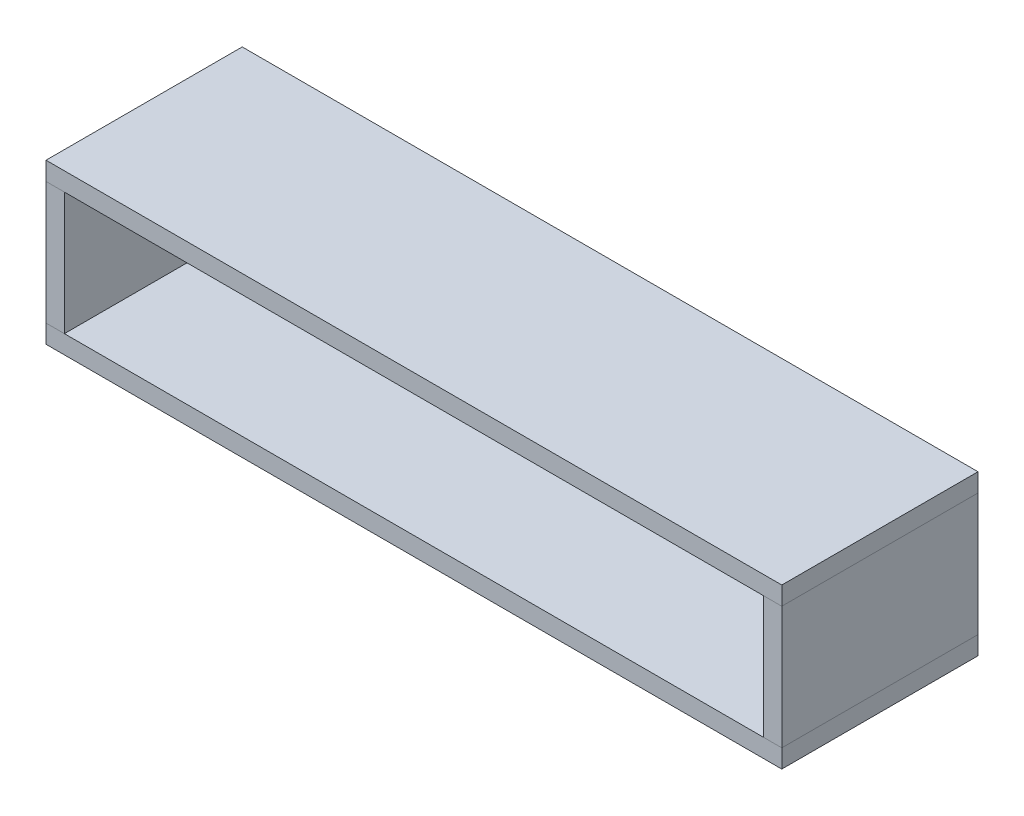
ISO-10303-21;
HEADER;
FILE_DESCRIPTION(('STEP AP214'),'2;1');
FILE_NAME('part.step','',(''),(''),'','','');
FILE_SCHEMA(('AUTOMOTIVE_DESIGN { 1 0 10303 214 1 1 1 1 }'));
ENDSEC;
DATA;
#1=APPLICATION_CONTEXT('core data for automotive mechanical design processes');
#2=APPLICATION_PROTOCOL_DEFINITION('international standard','automotive_design',2000,#1);
#3=PRODUCT_CONTEXT('',#1,'mechanical');
#4=PRODUCT('Part','Part','',(#3));
#5=PRODUCT_RELATED_PRODUCT_CATEGORY('part','',(#4));
#6=PRODUCT_DEFINITION_FORMATION('','',#4);
#7=PRODUCT_DEFINITION_CONTEXT('part definition',#1,'design');
#8=PRODUCT_DEFINITION('design','',#6,#7);
#9=PRODUCT_DEFINITION_SHAPE('','',#8);
#10=(LENGTH_UNIT() NAMED_UNIT(*) SI_UNIT(.MILLI.,.METRE.));
#11=(NAMED_UNIT(*) PLANE_ANGLE_UNIT() SI_UNIT($,.RADIAN.));
#12=(NAMED_UNIT(*) SI_UNIT($,.STERADIAN.) SOLID_ANGLE_UNIT());
#13=UNCERTAINTY_MEASURE_WITH_UNIT(LENGTH_MEASURE(1.E-05),#10,'distance_accuracy_value','');
#14=(GEOMETRIC_REPRESENTATION_CONTEXT(3) GLOBAL_UNCERTAINTY_ASSIGNED_CONTEXT((#13)) GLOBAL_UNIT_ASSIGNED_CONTEXT((#10,
#11,#12)) REPRESENTATION_CONTEXT('',''));
#15=CARTESIAN_POINT('',(0.,0.,0.));
#16=DIRECTION('',(0.,0.,1.));
#17=DIRECTION('',(1.,0.,0.));
#18=AXIS2_PLACEMENT_3D('',#15,#16,#17);
#19=CARTESIAN_POINT('',(-381.,165.1,-101.6));
#20=DIRECTION('',(1.,0.,0.));
#21=DIRECTION('',(0.,0.,-1.));
#22=AXIS2_PLACEMENT_3D('',#19,#20,#21);
#23=PLANE('',#22);
#24=DIRECTION('',(0.,0.,1.));
#25=VECTOR('',#24,1.);
#26=CARTESIAN_POINT('',(-381.,146.05,-101.6));
#27=LINE('',#26,#25);
#28=CARTESIAN_POINT('',(-381.,146.05,-101.6));
#29=VERTEX_POINT('',#28);
#30=CARTESIAN_POINT('',(-381.,146.05,101.6));
#31=VERTEX_POINT('',#30);
#32=EDGE_CURVE('E115',#29,#31,#27,.T.);
#33=ORIENTED_EDGE('',*,*,#32,.T.);
#34=DIRECTION('',(0.,-1.,0.));
#35=VECTOR('',#34,1.);
#36=CARTESIAN_POINT('',(-381.,165.1,101.6));
#37=LINE('',#36,#35);
#38=CARTESIAN_POINT('',(-381.,165.1,101.6));
#39=VERTEX_POINT('',#38);
#40=EDGE_CURVE('E12',#39,#31,#37,.T.);
#41=ORIENTED_EDGE('',*,*,#40,.F.);
#42=DIRECTION('',(0.,0.,1.));
#43=VECTOR('',#42,1.);
#44=CARTESIAN_POINT('',(-381.,165.1,-101.6));
#45=LINE('',#44,#43);
#46=CARTESIAN_POINT('',(-381.,165.1,-101.6));
#47=VERTEX_POINT('',#46);
#48=EDGE_CURVE('E103',#47,#39,#45,.T.);
#49=ORIENTED_EDGE('',*,*,#48,.F.);
#50=DIRECTION('',(0.,-1.,0.));
#51=VECTOR('',#50,1.);
#52=CARTESIAN_POINT('',(-381.,165.1,-101.6));
#53=LINE('',#52,#51);
#54=EDGE_CURVE('E111',#47,#29,#53,.T.);
#55=ORIENTED_EDGE('',*,*,#54,.T.);
#56=EDGE_LOOP('',(#33,#41,#49,#55));
#57=FACE_BOUND('',#56,.T.);
#58=ADVANCED_FACE('F52',(#57),#23,.F.);
#59=CARTESIAN_POINT('',(-381.,165.1,101.6));
#60=DIRECTION('',(0.,0.,-1.));
#61=DIRECTION('',(-1.,0.,0.));
#62=AXIS2_PLACEMENT_3D('',#59,#60,#61);
#63=PLANE('',#62);
#64=DIRECTION('',(1.,0.,0.));
#65=VECTOR('',#64,1.);
#66=CARTESIAN_POINT('',(-381.,146.05,101.6));
#67=LINE('',#66,#65);
#68=CARTESIAN_POINT('',(381.,146.05,101.6));
#69=VERTEX_POINT('',#68);
#70=EDGE_CURVE('E107',#31,#69,#67,.T.);
#71=ORIENTED_EDGE('',*,*,#70,.T.);
#72=DIRECTION('',(0.,-1.,0.));
#73=VECTOR('',#72,1.);
#74=CARTESIAN_POINT('',(381.,165.1,101.6));
#75=LINE('',#74,#73);
#76=CARTESIAN_POINT('',(381.,165.1,101.6));
#77=VERTEX_POINT('',#76);
#78=EDGE_CURVE('E60',#77,#69,#75,.T.);
#79=ORIENTED_EDGE('',*,*,#78,.F.);
#80=DIRECTION('',(1.,0.,0.));
#81=VECTOR('',#80,1.);
#82=CARTESIAN_POINT('',(-381.,165.1,101.6));
#83=LINE('',#82,#81);
#84=EDGE_CURVE('E98',#39,#77,#83,.T.);
#85=ORIENTED_EDGE('',*,*,#84,.F.);
#86=ORIENTED_EDGE('',*,*,#40,.T.);
#87=EDGE_LOOP('',(#71,#79,#85,#86));
#88=FACE_BOUND('',#87,.T.);
#89=ADVANCED_FACE('F106',(#88),#63,.F.);
#90=CARTESIAN_POINT('',(381.,165.1,-101.6));
#91=DIRECTION('',(-1.,0.,0.));
#92=DIRECTION('',(0.,0.,1.));
#93=AXIS2_PLACEMENT_3D('',#90,#91,#92);
#94=PLANE('',#93);
#95=DIRECTION('',(0.,0.,-1.));
#96=VECTOR('',#95,1.);
#97=CARTESIAN_POINT('',(381.,146.05,-101.6));
#98=LINE('',#97,#96);
#99=CARTESIAN_POINT('',(381.,146.05,-101.6));
#100=VERTEX_POINT('',#99);
#101=EDGE_CURVE('E85',#69,#100,#98,.T.);
#102=ORIENTED_EDGE('',*,*,#101,.T.);
#103=DIRECTION('',(0.,-1.,0.));
#104=VECTOR('',#103,1.);
#105=CARTESIAN_POINT('',(381.,165.1,-101.6));
#106=LINE('',#105,#104);
#107=CARTESIAN_POINT('',(381.,165.1,-101.6));
#108=VERTEX_POINT('',#107);
#109=EDGE_CURVE('E108',#108,#100,#106,.T.);
#110=ORIENTED_EDGE('',*,*,#109,.F.);
#111=DIRECTION('',(0.,0.,-1.));
#112=VECTOR('',#111,1.);
#113=CARTESIAN_POINT('',(381.,165.1,-101.6));
#114=LINE('',#113,#112);
#115=EDGE_CURVE('E101',#77,#108,#114,.T.);
#116=ORIENTED_EDGE('',*,*,#115,.F.);
#117=ORIENTED_EDGE('',*,*,#78,.T.);
#118=EDGE_LOOP('',(#102,#110,#116,#117));
#119=FACE_BOUND('',#118,.T.);
#120=ADVANCED_FACE('F109',(#119),#94,.F.);
#121=CARTESIAN_POINT('',(-381.,165.1,-101.6));
#122=DIRECTION('',(0.,0.,1.));
#123=DIRECTION('',(1.,0.,0.));
#124=AXIS2_PLACEMENT_3D('',#121,#122,#123);
#125=PLANE('',#124);
#126=DIRECTION('',(-1.,0.,0.));
#127=VECTOR('',#126,1.);
#128=CARTESIAN_POINT('',(-381.,146.05,-101.6));
#129=LINE('',#128,#127);
#130=EDGE_CURVE('E91',#100,#29,#129,.T.);
#131=ORIENTED_EDGE('',*,*,#130,.T.);
#132=ORIENTED_EDGE('',*,*,#54,.F.);
#133=DIRECTION('',(-1.,0.,0.));
#134=VECTOR('',#133,1.);
#135=CARTESIAN_POINT('',(-381.,165.1,-101.6));
#136=LINE('',#135,#134);
#137=EDGE_CURVE('E68',#108,#47,#136,.T.);
#138=ORIENTED_EDGE('',*,*,#137,.F.);
#139=ORIENTED_EDGE('',*,*,#109,.T.);
#140=EDGE_LOOP('',(#131,#132,#138,#139));
#141=FACE_BOUND('',#140,.T.);
#142=ADVANCED_FACE('F122',(#141),#125,.F.);
#143=CARTESIAN_POINT('',(0.,165.1,0.));
#144=DIRECTION('',(0.,1.,0.));
#145=DIRECTION('',(0.,0.,1.));
#146=AXIS2_PLACEMENT_3D('',#143,#144,#145);
#147=PLANE('',#146);
#148=ORIENTED_EDGE('',*,*,#48,.T.);
#149=ORIENTED_EDGE('',*,*,#84,.T.);
#150=ORIENTED_EDGE('',*,*,#115,.T.);
#151=ORIENTED_EDGE('',*,*,#137,.T.);
#152=EDGE_LOOP('',(#148,#149,#150,#151));
#153=FACE_BOUND('',#152,.T.);
#154=ADVANCED_FACE('F99',(#153),#147,.T.);
#155=CARTESIAN_POINT('',(0.,146.05,0.));
#156=DIRECTION('',(0.,1.,0.));
#157=DIRECTION('',(0.,0.,1.));
#158=AXIS2_PLACEMENT_3D('',#155,#156,#157);
#159=PLANE('',#158);
#160=ORIENTED_EDGE('',*,*,#32,.F.);
#161=ORIENTED_EDGE('',*,*,#130,.F.);
#162=ORIENTED_EDGE('',*,*,#101,.F.);
#163=ORIENTED_EDGE('',*,*,#70,.F.);
#164=EDGE_LOOP('',(#160,#161,#162,#163));
#165=FACE_BOUND('',#164,.T.);
#166=ADVANCED_FACE('F125',(#165),#159,.F.);
#167=CLOSED_SHELL('',(#58,#89,#120,#142,#154,#166));
#168=MANIFOLD_SOLID_BREP('B2_NOT_SHOWN',#167);
#169=CARTESIAN_POINT('',(-361.95,870.200614513307,0.));
#170=DIRECTION('',(1.,0.,0.));
#171=DIRECTION('',(0.,0.,-1.));
#172=AXIS2_PLACEMENT_3D('',#169,#170,#171);
#173=PLANE('',#172);
#174=DIRECTION('',(0.,0.,1.));
#175=VECTOR('',#174,1.);
#176=CARTESIAN_POINT('',(-361.95,146.05,0.));
#177=LINE('',#176,#175);
#178=CARTESIAN_POINT('',(-361.95,146.05,-101.6));
#179=VERTEX_POINT('',#178);
#180=CARTESIAN_POINT('',(-361.95,146.05,-82.55));
#181=VERTEX_POINT('',#180);
#182=EDGE_CURVE('E248',#179,#181,#177,.T.);
#183=ORIENTED_EDGE('',*,*,#182,.F.);
#184=DIRECTION('',(0.,-1.,0.));
#185=VECTOR('',#184,1.);
#186=CARTESIAN_POINT('',(-361.95,870.200614513307,-101.6));
#187=LINE('',#186,#185);
#188=CARTESIAN_POINT('',(-361.95,19.05,-101.6));
#189=VERTEX_POINT('',#188);
#190=EDGE_CURVE('E202',#179,#189,#187,.T.);
#191=ORIENTED_EDGE('',*,*,#190,.T.);
#192=DIRECTION('',(0.,0.,1.));
#193=VECTOR('',#192,1.);
#194=CARTESIAN_POINT('',(-361.95,19.05,0.));
#195=LINE('',#194,#193);
#196=CARTESIAN_POINT('',(-361.95,19.05,-82.55));
#197=VERTEX_POINT('',#196);
#198=EDGE_CURVE('E246',#189,#197,#195,.T.);
#199=ORIENTED_EDGE('',*,*,#198,.T.);
#200=DIRECTION('',(0.,-1.,0.));
#201=VECTOR('',#200,1.);
#202=CARTESIAN_POINT('',(-361.95,870.200614513307,-82.55));
#203=LINE('',#202,#201);
#204=EDGE_CURVE('E237',#181,#197,#203,.T.);
#205=ORIENTED_EDGE('',*,*,#204,.F.);
#206=EDGE_LOOP('',(#183,#191,#199,#205));
#207=FACE_BOUND('',#206,.T.);
#208=ADVANCED_FACE('F198',(#207),#173,.F.);
#209=CARTESIAN_POINT('',(0.,870.200614513307,-82.55));
#210=DIRECTION('',(0.,0.,-1.));
#211=DIRECTION('',(-1.,0.,0.));
#212=AXIS2_PLACEMENT_3D('',#209,#210,#211);
#213=PLANE('',#212);
#214=DIRECTION('',(1.,0.,0.));
#215=VECTOR('',#214,1.);
#216=CARTESIAN_POINT('',(0.,146.05,-82.55));
#217=LINE('',#216,#215);
#218=CARTESIAN_POINT('',(361.95,146.05,-82.55));
#219=VERTEX_POINT('',#218);
#220=EDGE_CURVE('E207',#181,#219,#217,.T.);
#221=ORIENTED_EDGE('',*,*,#220,.F.);
#222=ORIENTED_EDGE('',*,*,#204,.T.);
#223=DIRECTION('',(1.,0.,0.));
#224=VECTOR('',#223,1.);
#225=CARTESIAN_POINT('',(0.,19.05,-82.55));
#226=LINE('',#225,#224);
#227=CARTESIAN_POINT('',(361.95,19.05,-82.55));
#228=VERTEX_POINT('',#227);
#229=EDGE_CURVE('E258',#197,#228,#226,.T.);
#230=ORIENTED_EDGE('',*,*,#229,.T.);
#231=DIRECTION('',(0.,-1.,0.));
#232=VECTOR('',#231,1.);
#233=CARTESIAN_POINT('',(361.95,870.200614513307,-82.55));
#234=LINE('',#233,#232);
#235=EDGE_CURVE('E267',#219,#228,#234,.T.);
#236=ORIENTED_EDGE('',*,*,#235,.F.);
#237=EDGE_LOOP('',(#221,#222,#230,#236));
#238=FACE_BOUND('',#237,.T.);
#239=ADVANCED_FACE('F271',(#238),#213,.F.);
#240=CARTESIAN_POINT('',(361.95,870.200614513307,0.));
#241=DIRECTION('',(-1.,0.,0.));
#242=DIRECTION('',(0.,0.,1.));
#243=AXIS2_PLACEMENT_3D('',#240,#241,#242);
#244=PLANE('',#243);
#245=DIRECTION('',(0.,0.,-1.));
#246=VECTOR('',#245,1.);
#247=CARTESIAN_POINT('',(361.95,146.05,0.));
#248=LINE('',#247,#246);
#249=CARTESIAN_POINT('',(361.95,146.05,-101.6));
#250=VERTEX_POINT('',#249);
#251=EDGE_CURVE('E50',#219,#250,#248,.T.);
#252=ORIENTED_EDGE('',*,*,#251,.F.);
#253=ORIENTED_EDGE('',*,*,#235,.T.);
#254=DIRECTION('',(0.,0.,-1.));
#255=VECTOR('',#254,1.);
#256=CARTESIAN_POINT('',(361.95,19.05,0.));
#257=LINE('',#256,#255);
#258=CARTESIAN_POINT('',(361.95,19.05,-101.6));
#259=VERTEX_POINT('',#258);
#260=EDGE_CURVE('E268',#228,#259,#257,.T.);
#261=ORIENTED_EDGE('',*,*,#260,.T.);
#262=DIRECTION('',(0.,-1.,0.));
#263=VECTOR('',#262,1.);
#264=CARTESIAN_POINT('',(361.95,870.200614513307,-101.6));
#265=LINE('',#264,#263);
#266=EDGE_CURVE('E220',#250,#259,#265,.T.);
#267=ORIENTED_EDGE('',*,*,#266,.F.);
#268=EDGE_LOOP('',(#252,#253,#261,#267));
#269=FACE_BOUND('',#268,.T.);
#270=ADVANCED_FACE('F270',(#269),#244,.F.);
#271=CARTESIAN_POINT('',(0.,870.200614513307,-101.6));
#272=DIRECTION('',(0.,0.,1.));
#273=DIRECTION('',(1.,0.,0.));
#274=AXIS2_PLACEMENT_3D('',#271,#272,#273);
#275=PLANE('',#274);
#276=DIRECTION('',(-1.,0.,0.));
#277=VECTOR('',#276,1.);
#278=CARTESIAN_POINT('',(0.,146.05,-101.6));
#279=LINE('',#278,#277);
#280=EDGE_CURVE('E255',#250,#179,#279,.T.);
#281=ORIENTED_EDGE('',*,*,#280,.F.);
#282=ORIENTED_EDGE('',*,*,#266,.T.);
#283=DIRECTION('',(-1.,0.,0.));
#284=VECTOR('',#283,1.);
#285=CARTESIAN_POINT('',(0.,19.05,-101.6));
#286=LINE('',#285,#284);
#287=EDGE_CURVE('E251',#259,#189,#286,.T.);
#288=ORIENTED_EDGE('',*,*,#287,.T.);
#289=ORIENTED_EDGE('',*,*,#190,.F.);
#290=EDGE_LOOP('',(#281,#282,#288,#289));
#291=FACE_BOUND('',#290,.T.);
#292=ADVANCED_FACE('F252',(#291),#275,.F.);
#293=CARTESIAN_POINT('',(0.,19.05,0.));
#294=DIRECTION('',(0.,1.,0.));
#295=DIRECTION('',(0.,0.,1.));
#296=AXIS2_PLACEMENT_3D('',#293,#294,#295);
#297=PLANE('',#296);
#298=ORIENTED_EDGE('',*,*,#198,.F.);
#299=ORIENTED_EDGE('',*,*,#287,.F.);
#300=ORIENTED_EDGE('',*,*,#260,.F.);
#301=ORIENTED_EDGE('',*,*,#229,.F.);
#302=EDGE_LOOP('',(#298,#299,#300,#301));
#303=FACE_BOUND('',#302,.T.);
#304=ADVANCED_FACE('F257',(#303),#297,.F.);
#305=CARTESIAN_POINT('',(0.,146.05,0.));
#306=DIRECTION('',(0.,1.,0.));
#307=DIRECTION('',(0.,0.,1.));
#308=AXIS2_PLACEMENT_3D('',#305,#306,#307);
#309=PLANE('',#308);
#310=ORIENTED_EDGE('',*,*,#280,.T.);
#311=ORIENTED_EDGE('',*,*,#182,.T.);
#312=ORIENTED_EDGE('',*,*,#220,.T.);
#313=ORIENTED_EDGE('',*,*,#251,.T.);
#314=EDGE_LOOP('',(#310,#311,#312,#313));
#315=FACE_BOUND('',#314,.T.);
#316=ADVANCED_FACE('F200',(#315),#309,.T.);
#317=CLOSED_SHELL('',(#208,#239,#270,#292,#304,#316));
#318=MANIFOLD_SOLID_BREP('B6',#317);
#319=CARTESIAN_POINT('',(361.95,146.05,0.));
#320=DIRECTION('',(-1.,0.,0.));
#321=DIRECTION('',(0.,0.,1.));
#322=AXIS2_PLACEMENT_3D('',#319,#320,#321);
#323=PLANE('',#322);
#324=DIRECTION('',(0.,0.,-1.));
#325=VECTOR('',#324,1.);
#326=CARTESIAN_POINT('',(361.95,19.05,0.));
#327=LINE('',#326,#325);
#328=CARTESIAN_POINT('',(361.95,19.05,101.6));
#329=VERTEX_POINT('',#328);
#330=CARTESIAN_POINT('',(361.95,19.05,-101.6));
#331=VERTEX_POINT('',#330);
#332=EDGE_CURVE('E415',#329,#331,#327,.T.);
#333=ORIENTED_EDGE('',*,*,#332,.F.);
#334=DIRECTION('',(0.,-1.,0.));
#335=VECTOR('',#334,1.);
#336=CARTESIAN_POINT('',(361.95,146.05,101.6));
#337=LINE('',#336,#335);
#338=CARTESIAN_POINT('',(361.95,146.05,101.6));
#339=VERTEX_POINT('',#338);
#340=EDGE_CURVE('E196',#339,#329,#337,.T.);
#341=ORIENTED_EDGE('',*,*,#340,.F.);
#342=DIRECTION('',(0.,0.,-1.));
#343=VECTOR('',#342,1.);
#344=CARTESIAN_POINT('',(361.95,146.05,0.));
#345=LINE('',#344,#343);
#346=CARTESIAN_POINT('',(361.95,146.05,-101.6));
#347=VERTEX_POINT('',#346);
#348=EDGE_CURVE('E403',#339,#347,#345,.T.);
#349=ORIENTED_EDGE('',*,*,#348,.T.);
#350=DIRECTION('',(0.,-1.,0.));
#351=VECTOR('',#350,1.);
#352=CARTESIAN_POINT('',(361.95,146.05,-101.6));
#353=LINE('',#352,#351);
#354=EDGE_CURVE('E392',#347,#331,#353,.T.);
#355=ORIENTED_EDGE('',*,*,#354,.T.);
#356=EDGE_LOOP('',(#333,#341,#349,#355));
#357=FACE_BOUND('',#356,.T.);
#358=ADVANCED_FACE('F353',(#357),#323,.T.);
#359=CARTESIAN_POINT('',(0.,146.05,101.6));
#360=DIRECTION('',(0.,0.,-1.));
#361=DIRECTION('',(-1.,0.,0.));
#362=AXIS2_PLACEMENT_3D('',#359,#360,#361);
#363=PLANE('',#362);
#364=DIRECTION('',(1.,0.,0.));
#365=VECTOR('',#364,1.);
#366=CARTESIAN_POINT('',(0.,19.05,101.6));
#367=LINE('',#366,#365);
#368=CARTESIAN_POINT('',(381.,19.05,101.6));
#369=VERTEX_POINT('',#368);
#370=EDGE_CURVE('E408',#329,#369,#367,.T.);
#371=ORIENTED_EDGE('',*,*,#370,.T.);
#372=DIRECTION('',(0.,-1.,0.));
#373=VECTOR('',#372,1.);
#374=CARTESIAN_POINT('',(381.,146.05,101.6));
#375=LINE('',#374,#373);
#376=CARTESIAN_POINT('',(381.,146.05,101.6));
#377=VERTEX_POINT('',#376);
#378=EDGE_CURVE('E361',#377,#369,#375,.T.);
#379=ORIENTED_EDGE('',*,*,#378,.F.);
#380=DIRECTION('',(1.,0.,0.));
#381=VECTOR('',#380,1.);
#382=CARTESIAN_POINT('',(0.,146.05,101.6));
#383=LINE('',#382,#381);
#384=EDGE_CURVE('E398',#339,#377,#383,.T.);
#385=ORIENTED_EDGE('',*,*,#384,.F.);
#386=ORIENTED_EDGE('',*,*,#340,.T.);
#387=EDGE_LOOP('',(#371,#379,#385,#386));
#388=FACE_BOUND('',#387,.T.);
#389=ADVANCED_FACE('F406',(#388),#363,.F.);
#390=CARTESIAN_POINT('',(381.,146.05,0.));
#391=DIRECTION('',(-1.,0.,0.));
#392=DIRECTION('',(0.,0.,1.));
#393=AXIS2_PLACEMENT_3D('',#390,#391,#392);
#394=PLANE('',#393);
#395=DIRECTION('',(0.,0.,-1.));
#396=VECTOR('',#395,1.);
#397=CARTESIAN_POINT('',(381.,19.05,0.));
#398=LINE('',#397,#396);
#399=CARTESIAN_POINT('',(381.,19.05,-101.6));
#400=VERTEX_POINT('',#399);
#401=EDGE_CURVE('E385',#369,#400,#398,.T.);
#402=ORIENTED_EDGE('',*,*,#401,.T.);
#403=DIRECTION('',(0.,-1.,0.));
#404=VECTOR('',#403,1.);
#405=CARTESIAN_POINT('',(381.,146.05,-101.6));
#406=LINE('',#405,#404);
#407=CARTESIAN_POINT('',(381.,146.05,-101.6));
#408=VERTEX_POINT('',#407);
#409=EDGE_CURVE('E409',#408,#400,#406,.T.);
#410=ORIENTED_EDGE('',*,*,#409,.F.);
#411=DIRECTION('',(0.,0.,-1.));
#412=VECTOR('',#411,1.);
#413=CARTESIAN_POINT('',(381.,146.05,0.));
#414=LINE('',#413,#412);
#415=EDGE_CURVE('E402',#377,#408,#414,.T.);
#416=ORIENTED_EDGE('',*,*,#415,.F.);
#417=ORIENTED_EDGE('',*,*,#378,.T.);
#418=EDGE_LOOP('',(#402,#410,#416,#417));
#419=FACE_BOUND('',#418,.T.);
#420=ADVANCED_FACE('F410',(#419),#394,.F.);
#421=CARTESIAN_POINT('',(0.,146.05,-101.6));
#422=DIRECTION('',(0.,0.,1.));
#423=DIRECTION('',(1.,0.,0.));
#424=AXIS2_PLACEMENT_3D('',#421,#422,#423);
#425=PLANE('',#424);
#426=DIRECTION('',(-1.,0.,0.));
#427=VECTOR('',#426,1.);
#428=CARTESIAN_POINT('',(0.,19.05,-101.6));
#429=LINE('',#428,#427);
#430=EDGE_CURVE('E420',#400,#331,#429,.T.);
#431=ORIENTED_EDGE('',*,*,#430,.T.);
#432=ORIENTED_EDGE('',*,*,#354,.F.);
#433=DIRECTION('',(-1.,0.,0.));
#434=VECTOR('',#433,1.);
#435=CARTESIAN_POINT('',(0.,146.05,-101.6));
#436=LINE('',#435,#434);
#437=EDGE_CURVE('E369',#408,#347,#436,.T.);
#438=ORIENTED_EDGE('',*,*,#437,.F.);
#439=ORIENTED_EDGE('',*,*,#409,.T.);
#440=EDGE_LOOP('',(#431,#432,#438,#439));
#441=FACE_BOUND('',#440,.T.);
#442=ADVANCED_FACE('F425',(#441),#425,.F.);
#443=CARTESIAN_POINT('',(0.,146.05,0.));
#444=DIRECTION('',(0.,1.,0.));
#445=DIRECTION('',(0.,0.,1.));
#446=AXIS2_PLACEMENT_3D('',#443,#444,#445);
#447=PLANE('',#446);
#448=ORIENTED_EDGE('',*,*,#348,.F.);
#449=ORIENTED_EDGE('',*,*,#384,.T.);
#450=ORIENTED_EDGE('',*,*,#415,.T.);
#451=ORIENTED_EDGE('',*,*,#437,.T.);
#452=EDGE_LOOP('',(#448,#449,#450,#451));
#453=FACE_BOUND('',#452,.T.);
#454=ADVANCED_FACE('F400',(#453),#447,.T.);
#455=CARTESIAN_POINT('',(0.,19.05,0.));
#456=DIRECTION('',(0.,1.,0.));
#457=DIRECTION('',(0.,0.,1.));
#458=AXIS2_PLACEMENT_3D('',#455,#456,#457);
#459=PLANE('',#458);
#460=ORIENTED_EDGE('',*,*,#332,.T.);
#461=ORIENTED_EDGE('',*,*,#430,.F.);
#462=ORIENTED_EDGE('',*,*,#401,.F.);
#463=ORIENTED_EDGE('',*,*,#370,.F.);
#464=EDGE_LOOP('',(#460,#461,#462,#463));
#465=FACE_BOUND('',#464,.T.);
#466=ADVANCED_FACE('F427',(#465),#459,.F.);
#467=CLOSED_SHELL('',(#358,#389,#420,#442,#454,#466));
#468=MANIFOLD_SOLID_BREP('B44',#467);
#469=CARTESIAN_POINT('',(-361.95,146.05,0.));
#470=DIRECTION('',(1.,0.,0.));
#471=DIRECTION('',(0.,0.,-1.));
#472=AXIS2_PLACEMENT_3D('',#469,#470,#471);
#473=PLANE('',#472);
#474=DIRECTION('',(0.,0.,1.));
#475=VECTOR('',#474,1.);
#476=CARTESIAN_POINT('',(-361.95,19.05,0.));
#477=LINE('',#476,#475);
#478=CARTESIAN_POINT('',(-361.95,19.05,-101.6));
#479=VERTEX_POINT('',#478);
#480=CARTESIAN_POINT('',(-361.95,19.05,101.6));
#481=VERTEX_POINT('',#480);
#482=EDGE_CURVE('E572',#479,#481,#477,.T.);
#483=ORIENTED_EDGE('',*,*,#482,.F.);
#484=DIRECTION('',(0.,-1.,0.));
#485=VECTOR('',#484,1.);
#486=CARTESIAN_POINT('',(-361.95,146.05,-101.6));
#487=LINE('',#486,#485);
#488=CARTESIAN_POINT('',(-361.95,146.05,-101.6));
#489=VERTEX_POINT('',#488);
#490=EDGE_CURVE('E351',#489,#479,#487,.T.);
#491=ORIENTED_EDGE('',*,*,#490,.F.);
#492=DIRECTION('',(0.,0.,1.));
#493=VECTOR('',#492,1.);
#494=CARTESIAN_POINT('',(-361.95,146.05,0.));
#495=LINE('',#494,#493);
#496=CARTESIAN_POINT('',(-361.95,146.05,101.6));
#497=VERTEX_POINT('',#496);
#498=EDGE_CURVE('E560',#489,#497,#495,.T.);
#499=ORIENTED_EDGE('',*,*,#498,.T.);
#500=DIRECTION('',(0.,-1.,0.));
#501=VECTOR('',#500,1.);
#502=CARTESIAN_POINT('',(-361.95,146.05,101.6));
#503=LINE('',#502,#501);
#504=EDGE_CURVE('E549',#497,#481,#503,.T.);
#505=ORIENTED_EDGE('',*,*,#504,.T.);
#506=EDGE_LOOP('',(#483,#491,#499,#505));
#507=FACE_BOUND('',#506,.T.);
#508=ADVANCED_FACE('F510',(#507),#473,.T.);
#509=CARTESIAN_POINT('',(0.,146.05,-101.6));
#510=DIRECTION('',(0.,0.,1.));
#511=DIRECTION('',(1.,0.,0.));
#512=AXIS2_PLACEMENT_3D('',#509,#510,#511);
#513=PLANE('',#512);
#514=DIRECTION('',(-1.,0.,0.));
#515=VECTOR('',#514,1.);
#516=CARTESIAN_POINT('',(0.,19.05,-101.6));
#517=LINE('',#516,#515);
#518=CARTESIAN_POINT('',(-381.,19.05,-101.6));
#519=VERTEX_POINT('',#518);
#520=EDGE_CURVE('E565',#479,#519,#517,.T.);
#521=ORIENTED_EDGE('',*,*,#520,.T.);
#522=DIRECTION('',(0.,-1.,0.));
#523=VECTOR('',#522,1.);
#524=CARTESIAN_POINT('',(-381.,146.05,-101.6));
#525=LINE('',#524,#523);
#526=CARTESIAN_POINT('',(-381.,146.05,-101.6));
#527=VERTEX_POINT('',#526);
#528=EDGE_CURVE('E518',#527,#519,#525,.T.);
#529=ORIENTED_EDGE('',*,*,#528,.F.);
#530=DIRECTION('',(-1.,0.,0.));
#531=VECTOR('',#530,1.);
#532=CARTESIAN_POINT('',(0.,146.05,-101.6));
#533=LINE('',#532,#531);
#534=EDGE_CURVE('E555',#489,#527,#533,.T.);
#535=ORIENTED_EDGE('',*,*,#534,.F.);
#536=ORIENTED_EDGE('',*,*,#490,.T.);
#537=EDGE_LOOP('',(#521,#529,#535,#536));
#538=FACE_BOUND('',#537,.T.);
#539=ADVANCED_FACE('F563',(#538),#513,.F.);
#540=CARTESIAN_POINT('',(-381.,146.05,0.));
#541=DIRECTION('',(1.,0.,0.));
#542=DIRECTION('',(0.,0.,-1.));
#543=AXIS2_PLACEMENT_3D('',#540,#541,#542);
#544=PLANE('',#543);
#545=DIRECTION('',(0.,0.,1.));
#546=VECTOR('',#545,1.);
#547=CARTESIAN_POINT('',(-381.,19.05,0.));
#548=LINE('',#547,#546);
#549=CARTESIAN_POINT('',(-381.,19.05,101.6));
#550=VERTEX_POINT('',#549);
#551=EDGE_CURVE('E542',#519,#550,#548,.T.);
#552=ORIENTED_EDGE('',*,*,#551,.T.);
#553=DIRECTION('',(0.,-1.,0.));
#554=VECTOR('',#553,1.);
#555=CARTESIAN_POINT('',(-381.,146.05,101.6));
#556=LINE('',#555,#554);
#557=CARTESIAN_POINT('',(-381.,146.05,101.6));
#558=VERTEX_POINT('',#557);
#559=EDGE_CURVE('E566',#558,#550,#556,.T.);
#560=ORIENTED_EDGE('',*,*,#559,.F.);
#561=DIRECTION('',(0.,0.,1.));
#562=VECTOR('',#561,1.);
#563=CARTESIAN_POINT('',(-381.,146.05,0.));
#564=LINE('',#563,#562);
#565=EDGE_CURVE('E559',#527,#558,#564,.T.);
#566=ORIENTED_EDGE('',*,*,#565,.F.);
#567=ORIENTED_EDGE('',*,*,#528,.T.);
#568=EDGE_LOOP('',(#552,#560,#566,#567));
#569=FACE_BOUND('',#568,.T.);
#570=ADVANCED_FACE('F567',(#569),#544,.F.);
#571=CARTESIAN_POINT('',(0.,146.05,101.6));
#572=DIRECTION('',(0.,0.,-1.));
#573=DIRECTION('',(-1.,0.,0.));
#574=AXIS2_PLACEMENT_3D('',#571,#572,#573);
#575=PLANE('',#574);
#576=DIRECTION('',(1.,0.,0.));
#577=VECTOR('',#576,1.);
#578=CARTESIAN_POINT('',(0.,19.05,101.6));
#579=LINE('',#578,#577);
#580=EDGE_CURVE('E577',#550,#481,#579,.T.);
#581=ORIENTED_EDGE('',*,*,#580,.T.);
#582=ORIENTED_EDGE('',*,*,#504,.F.);
#583=DIRECTION('',(1.,0.,0.));
#584=VECTOR('',#583,1.);
#585=CARTESIAN_POINT('',(0.,146.05,101.6));
#586=LINE('',#585,#584);
#587=EDGE_CURVE('E526',#558,#497,#586,.T.);
#588=ORIENTED_EDGE('',*,*,#587,.F.);
#589=ORIENTED_EDGE('',*,*,#559,.T.);
#590=EDGE_LOOP('',(#581,#582,#588,#589));
#591=FACE_BOUND('',#590,.T.);
#592=ADVANCED_FACE('F582',(#591),#575,.F.);
#593=CARTESIAN_POINT('',(0.,146.05,0.));
#594=DIRECTION('',(0.,1.,0.));
#595=DIRECTION('',(0.,0.,1.));
#596=AXIS2_PLACEMENT_3D('',#593,#594,#595);
#597=PLANE('',#596);
#598=ORIENTED_EDGE('',*,*,#498,.F.);
#599=ORIENTED_EDGE('',*,*,#534,.T.);
#600=ORIENTED_EDGE('',*,*,#565,.T.);
#601=ORIENTED_EDGE('',*,*,#587,.T.);
#602=EDGE_LOOP('',(#598,#599,#600,#601));
#603=FACE_BOUND('',#602,.T.);
#604=ADVANCED_FACE('F557',(#603),#597,.T.);
#605=CARTESIAN_POINT('',(0.,19.05,0.));
#606=DIRECTION('',(0.,1.,0.));
#607=DIRECTION('',(0.,0.,1.));
#608=AXIS2_PLACEMENT_3D('',#605,#606,#607);
#609=PLANE('',#608);
#610=ORIENTED_EDGE('',*,*,#482,.T.);
#611=ORIENTED_EDGE('',*,*,#580,.F.);
#612=ORIENTED_EDGE('',*,*,#551,.F.);
#613=ORIENTED_EDGE('',*,*,#520,.F.);
#614=EDGE_LOOP('',(#610,#611,#612,#613));
#615=FACE_BOUND('',#614,.T.);
#616=ADVANCED_FACE('F584',(#615),#609,.F.);
#617=CLOSED_SHELL('',(#508,#539,#570,#592,#604,#616));
#618=MANIFOLD_SOLID_BREP('B190',#617);
#619=CARTESIAN_POINT('',(381.,19.05,-101.6));
#620=DIRECTION('',(-1.,0.,0.));
#621=DIRECTION('',(0.,0.,1.));
#622=AXIS2_PLACEMENT_3D('',#619,#620,#621);
#623=PLANE('',#622);
#624=DIRECTION('',(0.,0.,-1.));
#625=VECTOR('',#624,1.);
#626=CARTESIAN_POINT('',(381.,0.,-101.6));
#627=LINE('',#626,#625);
#628=CARTESIAN_POINT('',(381.,0.,101.6));
#629=VERTEX_POINT('',#628);
#630=CARTESIAN_POINT('',(381.,0.,-101.6));
#631=VERTEX_POINT('',#630);
#632=EDGE_CURVE('E721',#629,#631,#627,.T.);
#633=ORIENTED_EDGE('',*,*,#632,.T.);
#634=DIRECTION('',(0.,-1.,0.));
#635=VECTOR('',#634,1.);
#636=CARTESIAN_POINT('',(381.,19.05,-101.6));
#637=LINE('',#636,#635);
#638=CARTESIAN_POINT('',(381.,19.05,-101.6));
#639=VERTEX_POINT('',#638);
#640=EDGE_CURVE('E508',#639,#631,#637,.T.);
#641=ORIENTED_EDGE('',*,*,#640,.F.);
#642=DIRECTION('',(0.,0.,-1.));
#643=VECTOR('',#642,1.);
#644=CARTESIAN_POINT('',(381.,19.05,-101.6));
#645=LINE('',#644,#643);
#646=CARTESIAN_POINT('',(381.,19.05,101.6));
#647=VERTEX_POINT('',#646);
#648=EDGE_CURVE('E709',#647,#639,#645,.T.);
#649=ORIENTED_EDGE('',*,*,#648,.F.);
#650=DIRECTION('',(0.,-1.,0.));
#651=VECTOR('',#650,1.);
#652=CARTESIAN_POINT('',(381.,19.05,101.6));
#653=LINE('',#652,#651);
#654=EDGE_CURVE('E717',#647,#629,#653,.T.);
#655=ORIENTED_EDGE('',*,*,#654,.T.);
#656=EDGE_LOOP('',(#633,#641,#649,#655));
#657=FACE_BOUND('',#656,.T.);
#658=ADVANCED_FACE('F658',(#657),#623,.F.);
#659=CARTESIAN_POINT('',(-381.,19.05,-101.6));
#660=DIRECTION('',(0.,0.,1.));
#661=DIRECTION('',(1.,0.,0.));
#662=AXIS2_PLACEMENT_3D('',#659,#660,#661);
#663=PLANE('',#662);
#664=DIRECTION('',(-1.,0.,0.));
#665=VECTOR('',#664,1.);
#666=CARTESIAN_POINT('',(-381.,0.,-101.6));
#667=LINE('',#666,#665);
#668=CARTESIAN_POINT('',(-381.,0.,-101.6));
#669=VERTEX_POINT('',#668);
#670=EDGE_CURVE('E713',#631,#669,#667,.T.);
#671=ORIENTED_EDGE('',*,*,#670,.T.);
#672=DIRECTION('',(0.,-1.,0.));
#673=VECTOR('',#672,1.);
#674=CARTESIAN_POINT('',(-381.,19.05,-101.6));
#675=LINE('',#674,#673);
#676=CARTESIAN_POINT('',(-381.,19.05,-101.6));
#677=VERTEX_POINT('',#676);
#678=EDGE_CURVE('E666',#677,#669,#675,.T.);
#679=ORIENTED_EDGE('',*,*,#678,.F.);
#680=DIRECTION('',(-1.,0.,0.));
#681=VECTOR('',#680,1.);
#682=CARTESIAN_POINT('',(-381.,19.05,-101.6));
#683=LINE('',#682,#681);
#684=EDGE_CURVE('E704',#639,#677,#683,.T.);
#685=ORIENTED_EDGE('',*,*,#684,.F.);
#686=ORIENTED_EDGE('',*,*,#640,.T.);
#687=EDGE_LOOP('',(#671,#679,#685,#686));
#688=FACE_BOUND('',#687,.T.);
#689=ADVANCED_FACE('F712',(#688),#663,.F.);
#690=CARTESIAN_POINT('',(-381.,19.05,-101.6));
#691=DIRECTION('',(1.,0.,0.));
#692=DIRECTION('',(0.,0.,-1.));
#693=AXIS2_PLACEMENT_3D('',#690,#691,#692);
#694=PLANE('',#693);
#695=DIRECTION('',(0.,0.,1.));
#696=VECTOR('',#695,1.);
#697=CARTESIAN_POINT('',(-381.,0.,-101.6));
#698=LINE('',#697,#696);
#699=CARTESIAN_POINT('',(-381.,0.,101.6));
#700=VERTEX_POINT('',#699);
#701=EDGE_CURVE('E691',#669,#700,#698,.T.);
#702=ORIENTED_EDGE('',*,*,#701,.T.);
#703=DIRECTION('',(0.,-1.,0.));
#704=VECTOR('',#703,1.);
#705=CARTESIAN_POINT('',(-381.,19.05,101.6));
#706=LINE('',#705,#704);
#707=CARTESIAN_POINT('',(-381.,19.05,101.6));
#708=VERTEX_POINT('',#707);
#709=EDGE_CURVE('E714',#708,#700,#706,.T.);
#710=ORIENTED_EDGE('',*,*,#709,.F.);
#711=DIRECTION('',(0.,0.,1.));
#712=VECTOR('',#711,1.);
#713=CARTESIAN_POINT('',(-381.,19.05,-101.6));
#714=LINE('',#713,#712);
#715=EDGE_CURVE('E707',#677,#708,#714,.T.);
#716=ORIENTED_EDGE('',*,*,#715,.F.);
#717=ORIENTED_EDGE('',*,*,#678,.T.);
#718=EDGE_LOOP('',(#702,#710,#716,#717));
#719=FACE_BOUND('',#718,.T.);
#720=ADVANCED_FACE('F715',(#719),#694,.F.);
#721=CARTESIAN_POINT('',(-381.,19.05,101.6));
#722=DIRECTION('',(0.,0.,-1.));
#723=DIRECTION('',(-1.,0.,0.));
#724=AXIS2_PLACEMENT_3D('',#721,#722,#723);
#725=PLANE('',#724);
#726=DIRECTION('',(1.,0.,0.));
#727=VECTOR('',#726,1.);
#728=CARTESIAN_POINT('',(-381.,0.,101.6));
#729=LINE('',#728,#727);
#730=EDGE_CURVE('E697',#700,#629,#729,.T.);
#731=ORIENTED_EDGE('',*,*,#730,.T.);
#732=ORIENTED_EDGE('',*,*,#654,.F.);
#733=DIRECTION('',(1.,0.,0.));
#734=VECTOR('',#733,1.);
#735=CARTESIAN_POINT('',(-381.,19.05,101.6));
#736=LINE('',#735,#734);
#737=EDGE_CURVE('E674',#708,#647,#736,.T.);
#738=ORIENTED_EDGE('',*,*,#737,.F.);
#739=ORIENTED_EDGE('',*,*,#709,.T.);
#740=EDGE_LOOP('',(#731,#732,#738,#739));
#741=FACE_BOUND('',#740,.T.);
#742=ADVANCED_FACE('F728',(#741),#725,.F.);
#743=CARTESIAN_POINT('',(0.,19.05,0.));
#744=DIRECTION('',(0.,1.,0.));
#745=DIRECTION('',(0.,0.,1.));
#746=AXIS2_PLACEMENT_3D('',#743,#744,#745);
#747=PLANE('',#746);
#748=ORIENTED_EDGE('',*,*,#648,.T.);
#749=ORIENTED_EDGE('',*,*,#684,.T.);
#750=ORIENTED_EDGE('',*,*,#715,.T.);
#751=ORIENTED_EDGE('',*,*,#737,.T.);
#752=EDGE_LOOP('',(#748,#749,#750,#751));
#753=FACE_BOUND('',#752,.T.);
#754=ADVANCED_FACE('F705',(#753),#747,.T.);
#755=CARTESIAN_POINT('',(0.,0.,0.));
#756=DIRECTION('',(0.,1.,0.));
#757=DIRECTION('',(0.,0.,1.));
#758=AXIS2_PLACEMENT_3D('',#755,#756,#757);
#759=PLANE('',#758);
#760=ORIENTED_EDGE('',*,*,#632,.F.);
#761=ORIENTED_EDGE('',*,*,#730,.F.);
#762=ORIENTED_EDGE('',*,*,#701,.F.);
#763=ORIENTED_EDGE('',*,*,#670,.F.);
#764=EDGE_LOOP('',(#760,#761,#762,#763));
#765=FACE_BOUND('',#764,.T.);
#766=ADVANCED_FACE('F731',(#765),#759,.F.);
#767=CLOSED_SHELL('',(#658,#689,#720,#742,#754,#766));
#768=MANIFOLD_SOLID_BREP('B345',#767);
#769=ADVANCED_BREP_SHAPE_REPRESENTATION('',(#18,#168,#318,#468,#618,#768),#14);
#770=SHAPE_DEFINITION_REPRESENTATION(#9,#769);
ENDSEC;
END-ISO-10303-21;
